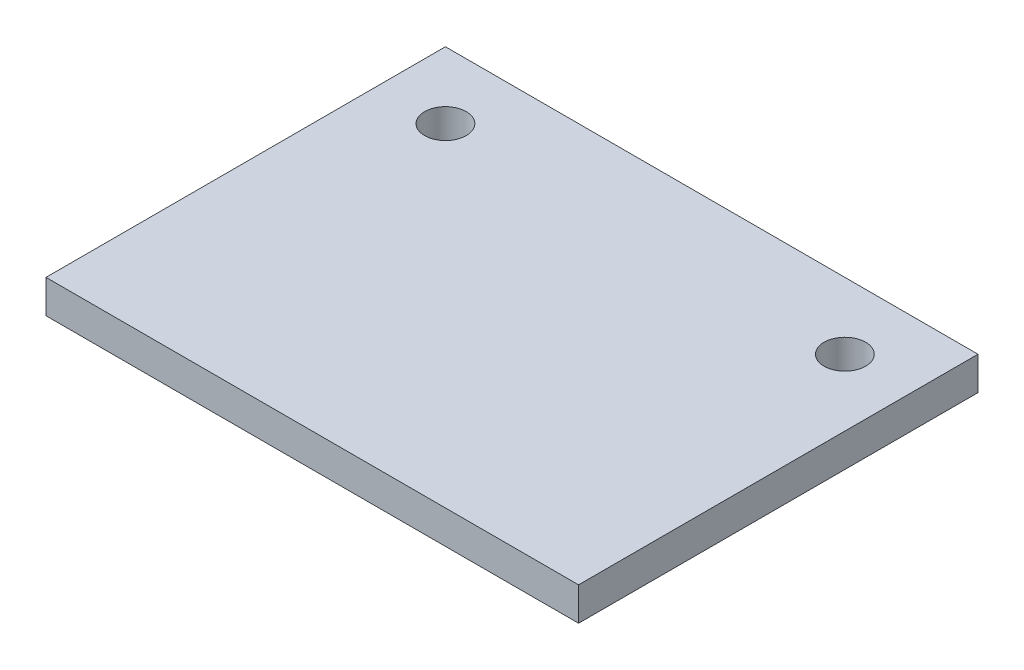
ISO-10303-21;
HEADER;
FILE_DESCRIPTION(('STEP AP214'),'2;1');
FILE_NAME('part.step','',(''),(''),'','','');
FILE_SCHEMA(('AUTOMOTIVE_DESIGN { 1 0 10303 214 1 1 1 1 }'));
ENDSEC;
DATA;
#1=APPLICATION_CONTEXT('core data for automotive mechanical design processes');
#2=APPLICATION_PROTOCOL_DEFINITION('international standard','automotive_design',2000,#1);
#3=PRODUCT_CONTEXT('',#1,'mechanical');
#4=PRODUCT('Part','Part','',(#3));
#5=PRODUCT_RELATED_PRODUCT_CATEGORY('part','',(#4));
#6=PRODUCT_DEFINITION_FORMATION('','',#4);
#7=PRODUCT_DEFINITION_CONTEXT('part definition',#1,'design');
#8=PRODUCT_DEFINITION('design','',#6,#7);
#9=PRODUCT_DEFINITION_SHAPE('','',#8);
#10=(LENGTH_UNIT() NAMED_UNIT(*) SI_UNIT(.MILLI.,.METRE.));
#11=(NAMED_UNIT(*) PLANE_ANGLE_UNIT() SI_UNIT($,.RADIAN.));
#12=(NAMED_UNIT(*) SI_UNIT($,.STERADIAN.) SOLID_ANGLE_UNIT());
#13=UNCERTAINTY_MEASURE_WITH_UNIT(LENGTH_MEASURE(1.E-05),#10,'distance_accuracy_value','');
#14=(GEOMETRIC_REPRESENTATION_CONTEXT(3) GLOBAL_UNCERTAINTY_ASSIGNED_CONTEXT((#13)) GLOBAL_UNIT_ASSIGNED_CONTEXT((#10,
#11,#12)) REPRESENTATION_CONTEXT('',''));
#15=CARTESIAN_POINT('',(0.,0.,0.));
#16=DIRECTION('',(0.,0.,1.));
#17=DIRECTION('',(1.,0.,0.));
#18=AXIS2_PLACEMENT_3D('',#15,#16,#17);
#19=CARTESIAN_POINT('',(0.,10.,0.));
#20=DIRECTION('',(0.,-1.,0.));
#21=DIRECTION('',(0.,0.,-1.));
#22=AXIS2_PLACEMENT_3D('',#19,#20,#21);
#23=PLANE('',#22);
#24=DIRECTION('',(0.,0.,-1.));
#25=VECTOR('',#24,1.);
#26=CARTESIAN_POINT('',(64.3902439024391,10.,-63.5121951219512));
#27=LINE('',#26,#25);
#28=CARTESIAN_POINT('',(64.3902439024391,10.,56.4878048780488));
#29=VERTEX_POINT('',#28);
#30=CARTESIAN_POINT('',(64.3902439024391,10.,-63.5121951219512));
#31=VERTEX_POINT('',#30);
#32=EDGE_CURVE('E86',#29,#31,#27,.T.);
#33=ORIENTED_EDGE('',*,*,#32,.T.);
#34=DIRECTION('',(-1.,0.,0.));
#35=VECTOR('',#34,1.);
#36=CARTESIAN_POINT('',(64.3902439024391,10.,-63.5121951219512));
#37=LINE('',#36,#35);
#38=CARTESIAN_POINT('',(-95.6097560975609,10.,-63.5121951219512));
#39=VERTEX_POINT('',#38);
#40=EDGE_CURVE('E81',#31,#39,#37,.T.);
#41=ORIENTED_EDGE('',*,*,#40,.T.);
#42=DIRECTION('',(0.,0.,1.));
#43=VECTOR('',#42,1.);
#44=CARTESIAN_POINT('',(-95.6097560975609,10.,-63.5121951219512));
#45=LINE('',#44,#43);
#46=CARTESIAN_POINT('',(-95.6097560975609,10.,56.4878048780488));
#47=VERTEX_POINT('',#46);
#48=EDGE_CURVE('E84',#39,#47,#45,.T.);
#49=ORIENTED_EDGE('',*,*,#48,.T.);
#50=DIRECTION('',(1.,0.,0.));
#51=VECTOR('',#50,1.);
#52=CARTESIAN_POINT('',(64.3902439024391,10.,56.4878048780488));
#53=LINE('',#52,#51);
#54=EDGE_CURVE('E51',#47,#29,#53,.T.);
#55=ORIENTED_EDGE('',*,*,#54,.T.);
#56=EDGE_LOOP('',(#33,#41,#49,#55));
#57=FACE_BOUND('',#56,.T.);
#58=CARTESIAN_POINT('',(44.3902439024391,10.,-43.5121951219512));
#59=DIRECTION('',(0.,1.,0.));
#60=DIRECTION('',(0.,0.,1.));
#61=AXIS2_PLACEMENT_3D('',#58,#59,#60);
#62=CIRCLE('',#61,6.25);
#63=CARTESIAN_POINT('',(44.3902439024391,10.,-37.2621951219512));
#64=VERTEX_POINT('',#63);
#65=EDGE_CURVE('E101',#64,#64,#62,.T.);
#66=ORIENTED_EDGE('',*,*,#65,.F.);
#67=EDGE_LOOP('',(#66));
#68=FACE_BOUND('',#67,.T.);
#69=CARTESIAN_POINT('',(-75.6097560975609,10.,-43.5121951219512));
#70=DIRECTION('',(0.,1.,0.));
#71=DIRECTION('',(0.,0.,1.));
#72=AXIS2_PLACEMENT_3D('',#69,#70,#71);
#73=CIRCLE('',#72,6.25);
#74=CARTESIAN_POINT('',(-75.6097560975609,10.,-37.2621951219512));
#75=VERTEX_POINT('',#74);
#76=EDGE_CURVE('E116',#75,#75,#73,.T.);
#77=ORIENTED_EDGE('',*,*,#76,.F.);
#78=EDGE_LOOP('',(#77));
#79=FACE_BOUND('',#78,.T.);
#80=ADVANCED_FACE('F34',(#57,#68,#79),#23,.F.);
#81=CARTESIAN_POINT('',(0.,0.,0.));
#82=DIRECTION('',(0.,-1.,0.));
#83=DIRECTION('',(0.,0.,-1.));
#84=AXIS2_PLACEMENT_3D('',#81,#82,#83);
#85=PLANE('',#84);
#86=CARTESIAN_POINT('',(44.3902439024391,0.,-43.5121951219512));
#87=DIRECTION('',(0.,1.,0.));
#88=DIRECTION('',(0.,0.,1.));
#89=AXIS2_PLACEMENT_3D('',#86,#87,#88);
#90=CIRCLE('',#89,6.25);
#91=CARTESIAN_POINT('',(44.3902439024391,0.,-37.2621951219512));
#92=VERTEX_POINT('',#91);
#93=EDGE_CURVE('E113',#92,#92,#90,.T.);
#94=ORIENTED_EDGE('',*,*,#93,.T.);
#95=EDGE_LOOP('',(#94));
#96=FACE_BOUND('',#95,.T.);
#97=DIRECTION('',(0.,0.,-1.));
#98=VECTOR('',#97,1.);
#99=CARTESIAN_POINT('',(64.3902439024391,0.,-63.5121951219512));
#100=LINE('',#99,#98);
#101=CARTESIAN_POINT('',(64.3902439024391,0.,56.4878048780488));
#102=VERTEX_POINT('',#101);
#103=CARTESIAN_POINT('',(64.3902439024391,0.,-63.5121951219512));
#104=VERTEX_POINT('',#103);
#105=EDGE_CURVE('E98',#102,#104,#100,.T.);
#106=ORIENTED_EDGE('',*,*,#105,.F.);
#107=DIRECTION('',(1.,0.,0.));
#108=VECTOR('',#107,1.);
#109=CARTESIAN_POINT('',(64.3902439024391,0.,56.4878048780488));
#110=LINE('',#109,#108);
#111=CARTESIAN_POINT('',(-95.6097560975609,0.,56.4878048780488));
#112=VERTEX_POINT('',#111);
#113=EDGE_CURVE('E74',#112,#102,#110,.T.);
#114=ORIENTED_EDGE('',*,*,#113,.F.);
#115=DIRECTION('',(0.,0.,1.));
#116=VECTOR('',#115,1.);
#117=CARTESIAN_POINT('',(-95.6097560975609,0.,-63.5121951219512));
#118=LINE('',#117,#116);
#119=CARTESIAN_POINT('',(-95.6097560975609,0.,-63.5121951219512));
#120=VERTEX_POINT('',#119);
#121=EDGE_CURVE('E68',#120,#112,#118,.T.);
#122=ORIENTED_EDGE('',*,*,#121,.F.);
#123=DIRECTION('',(-1.,0.,0.));
#124=VECTOR('',#123,1.);
#125=CARTESIAN_POINT('',(64.3902439024391,0.,-63.5121951219512));
#126=LINE('',#125,#124);
#127=EDGE_CURVE('E90',#104,#120,#126,.T.);
#128=ORIENTED_EDGE('',*,*,#127,.F.);
#129=EDGE_LOOP('',(#106,#114,#122,#128));
#130=FACE_BOUND('',#129,.T.);
#131=CARTESIAN_POINT('',(-75.6097560975609,0.,-43.5121951219512));
#132=DIRECTION('',(0.,1.,0.));
#133=DIRECTION('',(0.,0.,1.));
#134=AXIS2_PLACEMENT_3D('',#131,#132,#133);
#135=CIRCLE('',#134,6.25);
#136=CARTESIAN_POINT('',(-75.6097560975609,0.,-37.2621951219512));
#137=VERTEX_POINT('',#136);
#138=EDGE_CURVE('E119',#137,#137,#135,.T.);
#139=ORIENTED_EDGE('',*,*,#138,.T.);
#140=EDGE_LOOP('',(#139));
#141=FACE_BOUND('',#140,.T.);
#142=ADVANCED_FACE('F109',(#96,#130,#141),#85,.T.);
#143=CARTESIAN_POINT('',(64.3902439024391,10.,-63.5121951219512));
#144=DIRECTION('',(-1.,0.,0.));
#145=DIRECTION('',(0.,0.,1.));
#146=AXIS2_PLACEMENT_3D('',#143,#144,#145);
#147=PLANE('',#146);
#148=ORIENTED_EDGE('',*,*,#105,.T.);
#149=DIRECTION('',(0.,-1.,0.));
#150=VECTOR('',#149,1.);
#151=CARTESIAN_POINT('',(64.3902439024391,10.,-63.5121951219512));
#152=LINE('',#151,#150);
#153=EDGE_CURVE('E11',#31,#104,#152,.T.);
#154=ORIENTED_EDGE('',*,*,#153,.F.);
#155=ORIENTED_EDGE('',*,*,#32,.F.);
#156=DIRECTION('',(0.,-1.,0.));
#157=VECTOR('',#156,1.);
#158=CARTESIAN_POINT('',(64.3902439024391,10.,56.4878048780488));
#159=LINE('',#158,#157);
#160=EDGE_CURVE('E94',#29,#102,#159,.T.);
#161=ORIENTED_EDGE('',*,*,#160,.T.);
#162=EDGE_LOOP('',(#148,#154,#155,#161));
#163=FACE_BOUND('',#162,.T.);
#164=ADVANCED_FACE('F36',(#163),#147,.F.);
#165=CARTESIAN_POINT('',(64.3902439024391,10.,-63.5121951219512));
#166=DIRECTION('',(0.,0.,1.));
#167=DIRECTION('',(1.,0.,0.));
#168=AXIS2_PLACEMENT_3D('',#165,#166,#167);
#169=PLANE('',#168);
#170=ORIENTED_EDGE('',*,*,#127,.T.);
#171=DIRECTION('',(0.,-1.,0.));
#172=VECTOR('',#171,1.);
#173=CARTESIAN_POINT('',(-95.6097560975609,10.,-63.5121951219512));
#174=LINE('',#173,#172);
#175=EDGE_CURVE('E43',#39,#120,#174,.T.);
#176=ORIENTED_EDGE('',*,*,#175,.F.);
#177=ORIENTED_EDGE('',*,*,#40,.F.);
#178=ORIENTED_EDGE('',*,*,#153,.T.);
#179=EDGE_LOOP('',(#170,#176,#177,#178));
#180=FACE_BOUND('',#179,.T.);
#181=ADVANCED_FACE('F89',(#180),#169,.F.);
#182=CARTESIAN_POINT('',(-95.6097560975609,10.,-63.5121951219512));
#183=DIRECTION('',(1.,0.,0.));
#184=DIRECTION('',(0.,0.,-1.));
#185=AXIS2_PLACEMENT_3D('',#182,#183,#184);
#186=PLANE('',#185);
#187=ORIENTED_EDGE('',*,*,#121,.T.);
#188=DIRECTION('',(0.,-1.,0.));
#189=VECTOR('',#188,1.);
#190=CARTESIAN_POINT('',(-95.6097560975609,10.,56.4878048780488));
#191=LINE('',#190,#189);
#192=EDGE_CURVE('E91',#47,#112,#191,.T.);
#193=ORIENTED_EDGE('',*,*,#192,.F.);
#194=ORIENTED_EDGE('',*,*,#48,.F.);
#195=ORIENTED_EDGE('',*,*,#175,.T.);
#196=EDGE_LOOP('',(#187,#193,#194,#195));
#197=FACE_BOUND('',#196,.T.);
#198=ADVANCED_FACE('F92',(#197),#186,.F.);
#199=CARTESIAN_POINT('',(64.3902439024391,10.,56.4878048780488));
#200=DIRECTION('',(0.,0.,-1.));
#201=DIRECTION('',(-1.,0.,0.));
#202=AXIS2_PLACEMENT_3D('',#199,#200,#201);
#203=PLANE('',#202);
#204=ORIENTED_EDGE('',*,*,#113,.T.);
#205=ORIENTED_EDGE('',*,*,#160,.F.);
#206=ORIENTED_EDGE('',*,*,#54,.F.);
#207=ORIENTED_EDGE('',*,*,#192,.T.);
#208=EDGE_LOOP('',(#204,#205,#206,#207));
#209=FACE_BOUND('',#208,.T.);
#210=ADVANCED_FACE('F106',(#209),#203,.F.);
#211=CARTESIAN_POINT('',(44.3902439024391,10.,-43.5121951219512));
#212=DIRECTION('',(0.,-1.,0.));
#213=DIRECTION('',(0.,0.,-1.));
#214=AXIS2_PLACEMENT_3D('',#211,#212,#213);
#215=CYLINDRICAL_SURFACE('',#214,6.25);
#216=ORIENTED_EDGE('',*,*,#65,.T.);
#217=EDGE_LOOP('',(#216));
#218=FACE_BOUND('',#217,.T.);
#219=ORIENTED_EDGE('',*,*,#93,.F.);
#220=EDGE_LOOP('',(#219));
#221=FACE_BOUND('',#220,.T.);
#222=ADVANCED_FACE('F136',(#218,#221),#215,.F.);
#223=CARTESIAN_POINT('',(-75.6097560975609,10.,-43.5121951219512));
#224=DIRECTION('',(0.,-1.,0.));
#225=DIRECTION('',(0.,0.,-1.));
#226=AXIS2_PLACEMENT_3D('',#223,#224,#225);
#227=CYLINDRICAL_SURFACE('',#226,6.25);
#228=ORIENTED_EDGE('',*,*,#76,.T.);
#229=EDGE_LOOP('',(#228));
#230=FACE_BOUND('',#229,.T.);
#231=ORIENTED_EDGE('',*,*,#138,.F.);
#232=EDGE_LOOP('',(#231));
#233=FACE_BOUND('',#232,.T.);
#234=ADVANCED_FACE('F125',(#230,#233),#227,.F.);
#235=CLOSED_SHELL('',(#80,#142,#164,#181,#198,#210,#222,#234));
#236=MANIFOLD_SOLID_BREP('B2',#235);
#237=ADVANCED_BREP_SHAPE_REPRESENTATION('',(#18,#236),#14);
#238=SHAPE_DEFINITION_REPRESENTATION(#9,#237);
ENDSEC;
END-ISO-10303-21;
